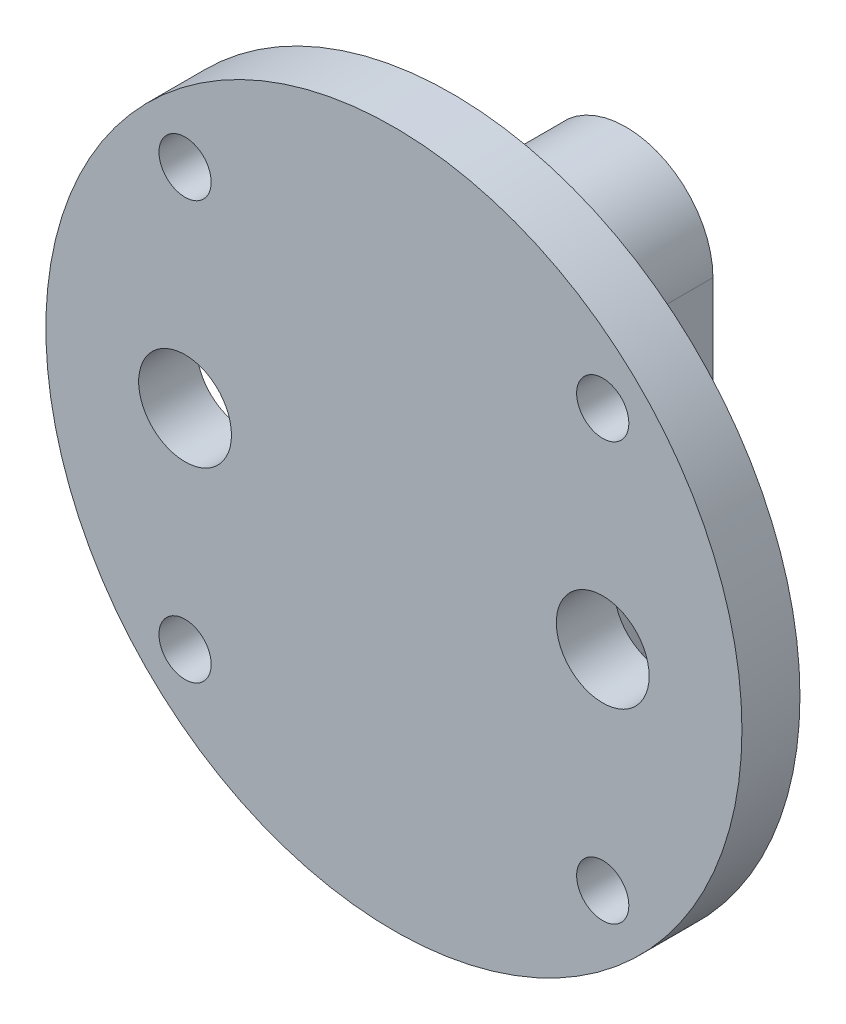
ISO-10303-21;
HEADER;
FILE_DESCRIPTION(('STEP AP214'),'2;1');
FILE_NAME('part.step','',(''),(''),'','','');
FILE_SCHEMA(('AUTOMOTIVE_DESIGN { 1 0 10303 214 1 1 1 1 }'));
ENDSEC;
DATA;
#1=APPLICATION_CONTEXT('core data for automotive mechanical design processes');
#2=APPLICATION_PROTOCOL_DEFINITION('international standard','automotive_design',2000,#1);
#3=PRODUCT_CONTEXT('',#1,'mechanical');
#4=PRODUCT('Part','Part','',(#3));
#5=PRODUCT_RELATED_PRODUCT_CATEGORY('part','',(#4));
#6=PRODUCT_DEFINITION_FORMATION('','',#4);
#7=PRODUCT_DEFINITION_CONTEXT('part definition',#1,'design');
#8=PRODUCT_DEFINITION('design','',#6,#7);
#9=PRODUCT_DEFINITION_SHAPE('','',#8);
#10=(LENGTH_UNIT() NAMED_UNIT(*) SI_UNIT(.MILLI.,.METRE.));
#11=(NAMED_UNIT(*) PLANE_ANGLE_UNIT() SI_UNIT($,.RADIAN.));
#12=(NAMED_UNIT(*) SI_UNIT($,.STERADIAN.) SOLID_ANGLE_UNIT());
#13=UNCERTAINTY_MEASURE_WITH_UNIT(LENGTH_MEASURE(1.E-05),#10,'distance_accuracy_value','');
#14=(GEOMETRIC_REPRESENTATION_CONTEXT(3) GLOBAL_UNCERTAINTY_ASSIGNED_CONTEXT((#13)) GLOBAL_UNIT_ASSIGNED_CONTEXT((#10,
#11,#12)) REPRESENTATION_CONTEXT('',''));
#15=CARTESIAN_POINT('',(0.,0.,0.));
#16=DIRECTION('',(0.,0.,1.));
#17=DIRECTION('',(1.,0.,0.));
#18=AXIS2_PLACEMENT_3D('',#15,#16,#17);
#19=CARTESIAN_POINT('',(0.,0.,5.));
#20=DIRECTION('',(0.,0.,1.));
#21=DIRECTION('',(1.,0.,0.));
#22=AXIS2_PLACEMENT_3D('',#19,#20,#21);
#23=PLANE('',#22);
#24=CARTESIAN_POINT('',(18.,-18.,5.));
#25=DIRECTION('',(0.,0.,1.));
#26=DIRECTION('',(1.,0.,0.));
#27=AXIS2_PLACEMENT_3D('',#24,#25,#26);
#28=CIRCLE('',#27,2.25);
#29=CARTESIAN_POINT('',(20.25,-18.,5.));
#30=VERTEX_POINT('',#29);
#31=EDGE_CURVE('E120',#30,#30,#28,.T.);
#32=ORIENTED_EDGE('',*,*,#31,.F.);
#33=EDGE_LOOP('',(#32));
#34=FACE_BOUND('',#33,.T.);
#35=CARTESIAN_POINT('',(-18.,18.,5.));
#36=DIRECTION('',(0.,0.,1.));
#37=DIRECTION('',(1.,0.,0.));
#38=AXIS2_PLACEMENT_3D('',#35,#36,#37);
#39=CIRCLE('',#38,2.25);
#40=CARTESIAN_POINT('',(-15.75,18.,5.));
#41=VERTEX_POINT('',#40);
#42=EDGE_CURVE('E136',#41,#41,#39,.T.);
#43=ORIENTED_EDGE('',*,*,#42,.F.);
#44=EDGE_LOOP('',(#43));
#45=FACE_BOUND('',#44,.T.);
#46=CARTESIAN_POINT('',(-18.,0.,5.));
#47=DIRECTION('',(0.,0.,1.));
#48=DIRECTION('',(1.,0.,0.));
#49=AXIS2_PLACEMENT_3D('',#46,#47,#48);
#50=CIRCLE('',#49,4.);
#51=CARTESIAN_POINT('',(-14.,0.,5.));
#52=VERTEX_POINT('',#51);
#53=EDGE_CURVE('E152',#52,#52,#50,.T.);
#54=ORIENTED_EDGE('',*,*,#53,.F.);
#55=EDGE_LOOP('',(#54));
#56=FACE_BOUND('',#55,.T.);
#57=CARTESIAN_POINT('',(0.,0.,5.));
#58=DIRECTION('',(0.,0.,1.));
#59=DIRECTION('',(1.,0.,0.));
#60=AXIS2_PLACEMENT_3D('',#57,#58,#59);
#61=CIRCLE('',#60,30.);
#62=CARTESIAN_POINT('',(30.,0.,5.));
#63=VERTEX_POINT('',#62);
#64=EDGE_CURVE('E11',#63,#63,#61,.T.);
#65=ORIENTED_EDGE('',*,*,#64,.T.);
#66=EDGE_LOOP('',(#65));
#67=FACE_BOUND('',#66,.T.);
#68=CARTESIAN_POINT('',(18.,18.,5.));
#69=DIRECTION('',(0.,0.,1.));
#70=DIRECTION('',(1.,0.,0.));
#71=AXIS2_PLACEMENT_3D('',#68,#69,#70);
#72=CIRCLE('',#71,2.25);
#73=CARTESIAN_POINT('',(20.25,18.,5.));
#74=VERTEX_POINT('',#73);
#75=EDGE_CURVE('E144',#74,#74,#72,.T.);
#76=ORIENTED_EDGE('',*,*,#75,.F.);
#77=EDGE_LOOP('',(#76));
#78=FACE_BOUND('',#77,.T.);
#79=CARTESIAN_POINT('',(-18.,-18.,5.));
#80=DIRECTION('',(0.,0.,1.));
#81=DIRECTION('',(1.,0.,0.));
#82=AXIS2_PLACEMENT_3D('',#79,#80,#81);
#83=CIRCLE('',#82,2.25);
#84=CARTESIAN_POINT('',(-15.75,-18.,5.));
#85=VERTEX_POINT('',#84);
#86=EDGE_CURVE('E128',#85,#85,#83,.T.);
#87=ORIENTED_EDGE('',*,*,#86,.F.);
#88=EDGE_LOOP('',(#87));
#89=FACE_BOUND('',#88,.T.);
#90=CARTESIAN_POINT('',(18.,0.,5.));
#91=DIRECTION('',(0.,0.,1.));
#92=DIRECTION('',(1.,0.,0.));
#93=AXIS2_PLACEMENT_3D('',#90,#91,#92);
#94=CIRCLE('',#93,4.);
#95=CARTESIAN_POINT('',(22.,0.,5.));
#96=VERTEX_POINT('',#95);
#97=EDGE_CURVE('E110',#96,#96,#94,.T.);
#98=ORIENTED_EDGE('',*,*,#97,.F.);
#99=EDGE_LOOP('',(#98));
#100=FACE_BOUND('',#99,.T.);
#101=ADVANCED_FACE('F39',(#34,#45,#56,#67,#78,#89,#100),#23,.T.);
#102=CARTESIAN_POINT('',(0.,0.,0.));
#103=DIRECTION('',(0.,0.,1.));
#104=DIRECTION('',(1.,0.,0.));
#105=AXIS2_PLACEMENT_3D('',#102,#103,#104);
#106=PLANE('',#105);
#107=CARTESIAN_POINT('',(0.,12.5,0.));
#108=DIRECTION('',(0.,0.,-1.));
#109=DIRECTION('',(-1.,0.,0.));
#110=AXIS2_PLACEMENT_3D('',#107,#108,#109);
#111=CIRCLE('',#110,7.5);
#112=CARTESIAN_POINT('',(-7.5,12.5,0.));
#113=VERTEX_POINT('',#112);
#114=CARTESIAN_POINT('',(7.50000000000001,12.5,0.));
#115=VERTEX_POINT('',#114);
#116=EDGE_CURVE('E55',#113,#115,#111,.T.);
#117=ORIENTED_EDGE('',*,*,#116,.F.);
#118=DIRECTION('',(0.,1.,0.));
#119=VECTOR('',#118,1.);
#120=CARTESIAN_POINT('',(-7.5,12.5,0.));
#121=LINE('',#120,#119);
#122=CARTESIAN_POINT('',(-7.5,-12.5,0.));
#123=VERTEX_POINT('',#122);
#124=EDGE_CURVE('E59',#123,#113,#121,.T.);
#125=ORIENTED_EDGE('',*,*,#124,.F.);
#126=CARTESIAN_POINT('',(0.,-12.5,0.));
#127=DIRECTION('',(0.,0.,-1.));
#128=DIRECTION('',(-1.,0.,0.));
#129=AXIS2_PLACEMENT_3D('',#126,#127,#128);
#130=CIRCLE('',#129,7.5);
#131=CARTESIAN_POINT('',(7.5,-12.5,0.));
#132=VERTEX_POINT('',#131);
#133=EDGE_CURVE('E364',#132,#123,#130,.T.);
#134=ORIENTED_EDGE('',*,*,#133,.F.);
#135=DIRECTION('',(0.,-1.,0.));
#136=VECTOR('',#135,1.);
#137=CARTESIAN_POINT('',(7.50000000000001,12.5,0.));
#138=LINE('',#137,#136);
#139=EDGE_CURVE('E361',#115,#132,#138,.T.);
#140=ORIENTED_EDGE('',*,*,#139,.F.);
#141=EDGE_LOOP('',(#117,#125,#134,#140));
#142=FACE_BOUND('',#141,.T.);
#143=CARTESIAN_POINT('',(0.,0.,0.));
#144=DIRECTION('',(0.,0.,1.));
#145=DIRECTION('',(1.,0.,0.));
#146=AXIS2_PLACEMENT_3D('',#143,#144,#145);
#147=CIRCLE('',#146,30.);
#148=CARTESIAN_POINT('',(30.,0.,0.));
#149=VERTEX_POINT('',#148);
#150=EDGE_CURVE('E43',#149,#149,#147,.T.);
#151=ORIENTED_EDGE('',*,*,#150,.F.);
#152=EDGE_LOOP('',(#151));
#153=FACE_BOUND('',#152,.T.);
#154=CARTESIAN_POINT('',(-18.,0.,0.));
#155=DIRECTION('',(0.,0.,1.));
#156=DIRECTION('',(1.,0.,0.));
#157=AXIS2_PLACEMENT_3D('',#154,#155,#156);
#158=CIRCLE('',#157,4.);
#159=CARTESIAN_POINT('',(-14.,0.,0.));
#160=VERTEX_POINT('',#159);
#161=EDGE_CURVE('E148',#160,#160,#158,.T.);
#162=ORIENTED_EDGE('',*,*,#161,.T.);
#163=EDGE_LOOP('',(#162));
#164=FACE_BOUND('',#163,.T.);
#165=CARTESIAN_POINT('',(18.,18.,0.));
#166=DIRECTION('',(0.,0.,1.));
#167=DIRECTION('',(1.,0.,0.));
#168=AXIS2_PLACEMENT_3D('',#165,#166,#167);
#169=CIRCLE('',#168,2.25);
#170=CARTESIAN_POINT('',(20.25,18.,0.));
#171=VERTEX_POINT('',#170);
#172=EDGE_CURVE('E140',#171,#171,#169,.T.);
#173=ORIENTED_EDGE('',*,*,#172,.T.);
#174=EDGE_LOOP('',(#173));
#175=FACE_BOUND('',#174,.T.);
#176=CARTESIAN_POINT('',(-18.,18.,0.));
#177=DIRECTION('',(0.,0.,1.));
#178=DIRECTION('',(1.,0.,0.));
#179=AXIS2_PLACEMENT_3D('',#176,#177,#178);
#180=CIRCLE('',#179,2.25);
#181=CARTESIAN_POINT('',(-15.75,18.,0.));
#182=VERTEX_POINT('',#181);
#183=EDGE_CURVE('E132',#182,#182,#180,.T.);
#184=ORIENTED_EDGE('',*,*,#183,.T.);
#185=EDGE_LOOP('',(#184));
#186=FACE_BOUND('',#185,.T.);
#187=CARTESIAN_POINT('',(-18.,-18.,0.));
#188=DIRECTION('',(0.,0.,1.));
#189=DIRECTION('',(1.,0.,0.));
#190=AXIS2_PLACEMENT_3D('',#187,#188,#189);
#191=CIRCLE('',#190,2.25);
#192=CARTESIAN_POINT('',(-15.75,-18.,0.));
#193=VERTEX_POINT('',#192);
#194=EDGE_CURVE('E124',#193,#193,#191,.T.);
#195=ORIENTED_EDGE('',*,*,#194,.T.);
#196=EDGE_LOOP('',(#195));
#197=FACE_BOUND('',#196,.T.);
#198=CARTESIAN_POINT('',(18.,-18.,0.));
#199=DIRECTION('',(0.,0.,1.));
#200=DIRECTION('',(1.,0.,0.));
#201=AXIS2_PLACEMENT_3D('',#198,#199,#200);
#202=CIRCLE('',#201,2.25);
#203=CARTESIAN_POINT('',(20.25,-18.,0.));
#204=VERTEX_POINT('',#203);
#205=EDGE_CURVE('E118',#204,#204,#202,.T.);
#206=ORIENTED_EDGE('',*,*,#205,.T.);
#207=EDGE_LOOP('',(#206));
#208=FACE_BOUND('',#207,.T.);
#209=CARTESIAN_POINT('',(18.,0.,0.));
#210=DIRECTION('',(0.,0.,1.));
#211=DIRECTION('',(1.,0.,0.));
#212=AXIS2_PLACEMENT_3D('',#209,#210,#211);
#213=CIRCLE('',#212,4.);
#214=CARTESIAN_POINT('',(22.,0.,0.));
#215=VERTEX_POINT('',#214);
#216=EDGE_CURVE('E105',#215,#215,#213,.T.);
#217=ORIENTED_EDGE('',*,*,#216,.T.);
#218=EDGE_LOOP('',(#217));
#219=FACE_BOUND('',#218,.T.);
#220=ADVANCED_FACE('F160',(#142,#153,#164,#175,#186,#197,#208,#219),#106,.F.);
#221=CARTESIAN_POINT('',(0.,0.,5.));
#222=DIRECTION('',(0.,0.,-1.));
#223=DIRECTION('',(-1.,0.,0.));
#224=AXIS2_PLACEMENT_3D('',#221,#222,#223);
#225=CYLINDRICAL_SURFACE('',#224,30.);
#226=ORIENTED_EDGE('',*,*,#64,.F.);
#227=EDGE_LOOP('',(#226));
#228=FACE_BOUND('',#227,.T.);
#229=ORIENTED_EDGE('',*,*,#150,.T.);
#230=EDGE_LOOP('',(#229));
#231=FACE_BOUND('',#230,.T.);
#232=ADVANCED_FACE('F41',(#228,#231),#225,.T.);
#233=CARTESIAN_POINT('',(-18.,0.,5.));
#234=DIRECTION('',(0.,0.,-1.));
#235=DIRECTION('',(-1.,0.,0.));
#236=AXIS2_PLACEMENT_3D('',#233,#234,#235);
#237=CYLINDRICAL_SURFACE('',#236,4.);
#238=ORIENTED_EDGE('',*,*,#53,.T.);
#239=EDGE_LOOP('',(#238));
#240=FACE_BOUND('',#239,.T.);
#241=ORIENTED_EDGE('',*,*,#161,.F.);
#242=EDGE_LOOP('',(#241));
#243=FACE_BOUND('',#242,.T.);
#244=ADVANCED_FACE('F163',(#240,#243),#237,.F.);
#245=CARTESIAN_POINT('',(18.,18.,5.));
#246=DIRECTION('',(0.,0.,-1.));
#247=DIRECTION('',(-1.,0.,0.));
#248=AXIS2_PLACEMENT_3D('',#245,#246,#247);
#249=CYLINDRICAL_SURFACE('',#248,2.25);
#250=ORIENTED_EDGE('',*,*,#75,.T.);
#251=EDGE_LOOP('',(#250));
#252=FACE_BOUND('',#251,.T.);
#253=ORIENTED_EDGE('',*,*,#172,.F.);
#254=EDGE_LOOP('',(#253));
#255=FACE_BOUND('',#254,.T.);
#256=ADVANCED_FACE('F165',(#252,#255),#249,.F.);
#257=CARTESIAN_POINT('',(-18.,18.,5.));
#258=DIRECTION('',(0.,0.,-1.));
#259=DIRECTION('',(-1.,0.,0.));
#260=AXIS2_PLACEMENT_3D('',#257,#258,#259);
#261=CYLINDRICAL_SURFACE('',#260,2.25);
#262=ORIENTED_EDGE('',*,*,#42,.T.);
#263=EDGE_LOOP('',(#262));
#264=FACE_BOUND('',#263,.T.);
#265=ORIENTED_EDGE('',*,*,#183,.F.);
#266=EDGE_LOOP('',(#265));
#267=FACE_BOUND('',#266,.T.);
#268=ADVANCED_FACE('F172',(#264,#267),#261,.F.);
#269=CARTESIAN_POINT('',(-18.,-18.,5.));
#270=DIRECTION('',(0.,0.,-1.));
#271=DIRECTION('',(-1.,0.,0.));
#272=AXIS2_PLACEMENT_3D('',#269,#270,#271);
#273=CYLINDRICAL_SURFACE('',#272,2.25);
#274=ORIENTED_EDGE('',*,*,#86,.T.);
#275=EDGE_LOOP('',(#274));
#276=FACE_BOUND('',#275,.T.);
#277=ORIENTED_EDGE('',*,*,#194,.F.);
#278=EDGE_LOOP('',(#277));
#279=FACE_BOUND('',#278,.T.);
#280=ADVANCED_FACE('F211',(#276,#279),#273,.F.);
#281=CARTESIAN_POINT('',(18.,-18.,5.));
#282=DIRECTION('',(0.,0.,-1.));
#283=DIRECTION('',(-1.,0.,0.));
#284=AXIS2_PLACEMENT_3D('',#281,#282,#283);
#285=CYLINDRICAL_SURFACE('',#284,2.25);
#286=ORIENTED_EDGE('',*,*,#31,.T.);
#287=EDGE_LOOP('',(#286));
#288=FACE_BOUND('',#287,.T.);
#289=ORIENTED_EDGE('',*,*,#205,.F.);
#290=EDGE_LOOP('',(#289));
#291=FACE_BOUND('',#290,.T.);
#292=ADVANCED_FACE('F201',(#288,#291),#285,.F.);
#293=CARTESIAN_POINT('',(18.,0.,5.));
#294=DIRECTION('',(0.,0.,-1.));
#295=DIRECTION('',(-1.,0.,0.));
#296=AXIS2_PLACEMENT_3D('',#293,#294,#295);
#297=CYLINDRICAL_SURFACE('',#296,4.);
#298=ORIENTED_EDGE('',*,*,#97,.T.);
#299=EDGE_LOOP('',(#298));
#300=FACE_BOUND('',#299,.T.);
#301=ORIENTED_EDGE('',*,*,#216,.F.);
#302=EDGE_LOOP('',(#301));
#303=FACE_BOUND('',#302,.T.);
#304=ADVANCED_FACE('F198',(#300,#303),#297,.F.);
#305=CARTESIAN_POINT('',(0.,12.5,-15.));
#306=DIRECTION('',(0.,0.,-1.));
#307=DIRECTION('',(-1.,0.,0.));
#308=AXIS2_PLACEMENT_3D('',#305,#306,#307);
#309=PLANE('',#308);
#310=CARTESIAN_POINT('',(0.,12.5,-15.));
#311=DIRECTION('',(0.,0.,-1.));
#312=DIRECTION('',(-1.,0.,0.));
#313=AXIS2_PLACEMENT_3D('',#310,#311,#312);
#314=CIRCLE('',#313,2.8);
#315=CARTESIAN_POINT('',(-2.8,12.5,-15.));
#316=VERTEX_POINT('',#315);
#317=EDGE_CURVE('E347',#316,#316,#314,.T.);
#318=ORIENTED_EDGE('',*,*,#317,.F.);
#319=EDGE_LOOP('',(#318));
#320=FACE_BOUND('',#319,.T.);
#321=CARTESIAN_POINT('',(0.,12.5,-15.));
#322=DIRECTION('',(0.,0.,-1.));
#323=DIRECTION('',(-1.,0.,0.));
#324=AXIS2_PLACEMENT_3D('',#321,#322,#323);
#325=CIRCLE('',#324,7.5);
#326=CARTESIAN_POINT('',(-7.5,12.5,-15.));
#327=VERTEX_POINT('',#326);
#328=CARTESIAN_POINT('',(7.50000000000001,12.5,-15.));
#329=VERTEX_POINT('',#328);
#330=EDGE_CURVE('E91',#327,#329,#325,.T.);
#331=ORIENTED_EDGE('',*,*,#330,.T.);
#332=DIRECTION('',(0.,-1.,0.));
#333=VECTOR('',#332,1.);
#334=CARTESIAN_POINT('',(7.50000000000001,12.5,-15.));
#335=LINE('',#334,#333);
#336=CARTESIAN_POINT('',(7.5,-12.5,-15.));
#337=VERTEX_POINT('',#336);
#338=EDGE_CURVE('E79',#329,#337,#335,.T.);
#339=ORIENTED_EDGE('',*,*,#338,.T.);
#340=CARTESIAN_POINT('',(0.,-12.5,-15.));
#341=DIRECTION('',(0.,0.,-1.));
#342=DIRECTION('',(-1.,0.,0.));
#343=AXIS2_PLACEMENT_3D('',#340,#341,#342);
#344=CIRCLE('',#343,7.5);
#345=CARTESIAN_POINT('',(-7.5,-12.5,-15.));
#346=VERTEX_POINT('',#345);
#347=EDGE_CURVE('E90',#337,#346,#344,.T.);
#348=ORIENTED_EDGE('',*,*,#347,.T.);
#349=DIRECTION('',(0.,1.,0.));
#350=VECTOR('',#349,1.);
#351=CARTESIAN_POINT('',(-7.5,12.5,-15.));
#352=LINE('',#351,#350);
#353=EDGE_CURVE('E97',#346,#327,#352,.T.);
#354=ORIENTED_EDGE('',*,*,#353,.T.);
#355=EDGE_LOOP('',(#331,#339,#348,#354));
#356=FACE_BOUND('',#355,.T.);
#357=CARTESIAN_POINT('',(0.,-12.5,-15.));
#358=DIRECTION('',(0.,0.,-1.));
#359=DIRECTION('',(-1.,0.,0.));
#360=AXIS2_PLACEMENT_3D('',#357,#358,#359);
#361=CIRCLE('',#360,2.8);
#362=CARTESIAN_POINT('',(-2.8,-12.5,-15.));
#363=VERTEX_POINT('',#362);
#364=EDGE_CURVE('E340',#363,#363,#361,.T.);
#365=ORIENTED_EDGE('',*,*,#364,.F.);
#366=EDGE_LOOP('',(#365));
#367=FACE_BOUND('',#366,.T.);
#368=ADVANCED_FACE('F94',(#320,#356,#367),#309,.T.);
#369=CARTESIAN_POINT('',(0.,12.5,-15.));
#370=DIRECTION('',(0.,0.,1.));
#371=DIRECTION('',(1.,0.,0.));
#372=AXIS2_PLACEMENT_3D('',#369,#370,#371);
#373=CYLINDRICAL_SURFACE('',#372,7.5);
#374=ORIENTED_EDGE('',*,*,#116,.T.);
#375=DIRECTION('',(0.,0.,1.));
#376=VECTOR('',#375,1.);
#377=CARTESIAN_POINT('',(7.50000000000001,12.5,-15.));
#378=LINE('',#377,#376);
#379=EDGE_CURVE('E84',#329,#115,#378,.T.);
#380=ORIENTED_EDGE('',*,*,#379,.F.);
#381=ORIENTED_EDGE('',*,*,#330,.F.);
#382=DIRECTION('',(0.,0.,1.));
#383=VECTOR('',#382,1.);
#384=CARTESIAN_POINT('',(-7.5,12.5,-15.));
#385=LINE('',#384,#383);
#386=EDGE_CURVE('E358',#327,#113,#385,.T.);
#387=ORIENTED_EDGE('',*,*,#386,.T.);
#388=EDGE_LOOP('',(#374,#380,#381,#387));
#389=FACE_BOUND('',#388,.T.);
#390=ADVANCED_FACE('F103',(#389),#373,.T.);
#391=CARTESIAN_POINT('',(7.50000000000001,12.5,-15.));
#392=DIRECTION('',(-1.,0.,0.));
#393=DIRECTION('',(0.,-1.,0.));
#394=AXIS2_PLACEMENT_3D('',#391,#392,#393);
#395=PLANE('',#394);
#396=ORIENTED_EDGE('',*,*,#139,.T.);
#397=DIRECTION('',(0.,0.,1.));
#398=VECTOR('',#397,1.);
#399=CARTESIAN_POINT('',(7.5,-12.5,-15.));
#400=LINE('',#399,#398);
#401=EDGE_CURVE('E86',#337,#132,#400,.T.);
#402=ORIENTED_EDGE('',*,*,#401,.F.);
#403=ORIENTED_EDGE('',*,*,#338,.F.);
#404=ORIENTED_EDGE('',*,*,#379,.T.);
#405=EDGE_LOOP('',(#396,#402,#403,#404));
#406=FACE_BOUND('',#405,.T.);
#407=ADVANCED_FACE('F82',(#406),#395,.F.);
#408=CARTESIAN_POINT('',(0.,-12.5,-15.));
#409=DIRECTION('',(0.,0.,1.));
#410=DIRECTION('',(1.,0.,0.));
#411=AXIS2_PLACEMENT_3D('',#408,#409,#410);
#412=CYLINDRICAL_SURFACE('',#411,7.5);
#413=ORIENTED_EDGE('',*,*,#133,.T.);
#414=DIRECTION('',(0.,0.,1.));
#415=VECTOR('',#414,1.);
#416=CARTESIAN_POINT('',(-7.5,-12.5,-15.));
#417=LINE('',#416,#415);
#418=EDGE_CURVE('E112',#346,#123,#417,.T.);
#419=ORIENTED_EDGE('',*,*,#418,.F.);
#420=ORIENTED_EDGE('',*,*,#347,.F.);
#421=ORIENTED_EDGE('',*,*,#401,.T.);
#422=EDGE_LOOP('',(#413,#419,#420,#421));
#423=FACE_BOUND('',#422,.T.);
#424=ADVANCED_FACE('F279',(#423),#412,.T.);
#425=CARTESIAN_POINT('',(-7.5,12.5,-15.));
#426=DIRECTION('',(1.,0.,0.));
#427=DIRECTION('',(0.,1.,0.));
#428=AXIS2_PLACEMENT_3D('',#425,#426,#427);
#429=PLANE('',#428);
#430=ORIENTED_EDGE('',*,*,#124,.T.);
#431=ORIENTED_EDGE('',*,*,#386,.F.);
#432=ORIENTED_EDGE('',*,*,#353,.F.);
#433=ORIENTED_EDGE('',*,*,#418,.T.);
#434=EDGE_LOOP('',(#430,#431,#432,#433));
#435=FACE_BOUND('',#434,.T.);
#436=ADVANCED_FACE('F287',(#435),#429,.F.);
#437=CARTESIAN_POINT('',(0.,12.5,-15.));
#438=DIRECTION('',(0.,0.,1.));
#439=DIRECTION('',(1.,0.,0.));
#440=AXIS2_PLACEMENT_3D('',#437,#438,#439);
#441=CYLINDRICAL_SURFACE('',#440,2.8);
#442=ORIENTED_EDGE('',*,*,#317,.T.);
#443=EDGE_LOOP('',(#442));
#444=FACE_BOUND('',#443,.T.);
#445=CARTESIAN_POINT('',(0.,12.5,0.));
#446=DIRECTION('',(0.,0.,-1.));
#447=DIRECTION('',(-1.,0.,0.));
#448=AXIS2_PLACEMENT_3D('',#445,#446,#447);
#449=CIRCLE('',#448,2.8);
#450=CARTESIAN_POINT('',(-2.8,12.5,0.));
#451=VERTEX_POINT('',#450);
#452=EDGE_CURVE('E344',#451,#451,#449,.T.);
#453=ORIENTED_EDGE('',*,*,#452,.F.);
#454=EDGE_LOOP('',(#453));
#455=FACE_BOUND('',#454,.T.);
#456=ADVANCED_FACE('F297',(#444,#455),#441,.F.);
#457=CARTESIAN_POINT('',(0.,-12.5,-15.));
#458=DIRECTION('',(0.,0.,1.));
#459=DIRECTION('',(1.,0.,0.));
#460=AXIS2_PLACEMENT_3D('',#457,#458,#459);
#461=CYLINDRICAL_SURFACE('',#460,2.8);
#462=ORIENTED_EDGE('',*,*,#364,.T.);
#463=EDGE_LOOP('',(#462));
#464=FACE_BOUND('',#463,.T.);
#465=CARTESIAN_POINT('',(0.,-12.5,0.));
#466=DIRECTION('',(0.,0.,-1.));
#467=DIRECTION('',(-1.,0.,0.));
#468=AXIS2_PLACEMENT_3D('',#465,#466,#467);
#469=CIRCLE('',#468,2.8);
#470=CARTESIAN_POINT('',(-2.8,-12.5,0.));
#471=VERTEX_POINT('',#470);
#472=EDGE_CURVE('E337',#471,#471,#469,.T.);
#473=ORIENTED_EDGE('',*,*,#472,.F.);
#474=EDGE_LOOP('',(#473));
#475=FACE_BOUND('',#474,.T.);
#476=ADVANCED_FACE('F307',(#464,#475),#461,.F.);
#477=ORIENTED_EDGE('',*,*,#452,.T.);
#478=EDGE_LOOP('',(#477));
#479=FACE_BOUND('',#478,.T.);
#480=ADVANCED_FACE('F182',(#479),#106,.F.);
#481=ORIENTED_EDGE('',*,*,#472,.T.);
#482=EDGE_LOOP('',(#481));
#483=FACE_BOUND('',#482,.T.);
#484=ADVANCED_FACE('F183',(#483),#106,.F.);
#485=CLOSED_SHELL('',(#101,#220,#232,#244,#256,#268,#280,#292,#304,#368,#390,#407,#424,#436,
#456,#476,#480,#484));
#486=MANIFOLD_SOLID_BREP('B2',#485);
#487=ADVANCED_BREP_SHAPE_REPRESENTATION('',(#18,#486),#14);
#488=SHAPE_DEFINITION_REPRESENTATION(#9,#487);
ENDSEC;
END-ISO-10303-21;
